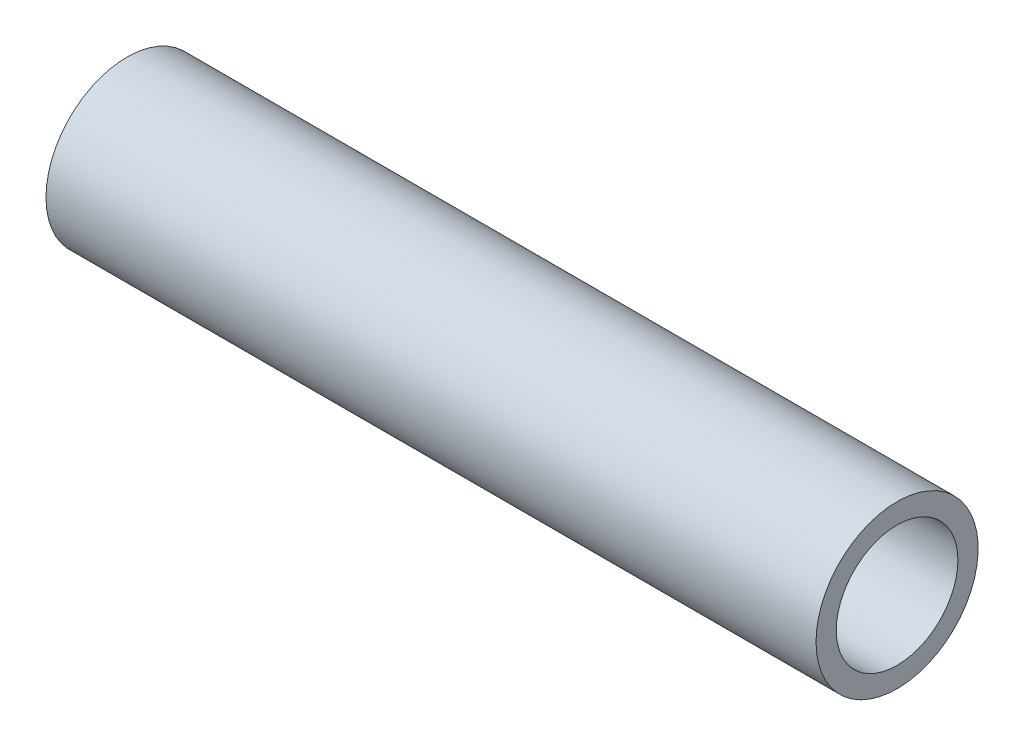
ISO-10303-21;
HEADER;
FILE_DESCRIPTION(('STEP AP214'),'2;1');
FILE_NAME('part.step','',(''),(''),'','','');
FILE_SCHEMA(('AUTOMOTIVE_DESIGN { 1 0 10303 214 1 1 1 1 }'));
ENDSEC;
DATA;
#1=APPLICATION_CONTEXT('core data for automotive mechanical design processes');
#2=APPLICATION_PROTOCOL_DEFINITION('international standard','automotive_design',2000,#1);
#3=PRODUCT_CONTEXT('',#1,'mechanical');
#4=PRODUCT('Part','Part','',(#3));
#5=PRODUCT_RELATED_PRODUCT_CATEGORY('part','',(#4));
#6=PRODUCT_DEFINITION_FORMATION('','',#4);
#7=PRODUCT_DEFINITION_CONTEXT('part definition',#1,'design');
#8=PRODUCT_DEFINITION('design','',#6,#7);
#9=PRODUCT_DEFINITION_SHAPE('','',#8);
#10=(LENGTH_UNIT() NAMED_UNIT(*) SI_UNIT(.MILLI.,.METRE.));
#11=(NAMED_UNIT(*) PLANE_ANGLE_UNIT() SI_UNIT($,.RADIAN.));
#12=(NAMED_UNIT(*) SI_UNIT($,.STERADIAN.) SOLID_ANGLE_UNIT());
#13=UNCERTAINTY_MEASURE_WITH_UNIT(LENGTH_MEASURE(1.E-05),#10,'distance_accuracy_value','');
#14=(GEOMETRIC_REPRESENTATION_CONTEXT(3) GLOBAL_UNCERTAINTY_ASSIGNED_CONTEXT((#13)) GLOBAL_UNIT_ASSIGNED_CONTEXT((#10,
#11,#12)) REPRESENTATION_CONTEXT('',''));
#15=CARTESIAN_POINT('',(0.,0.,0.));
#16=DIRECTION('',(0.,0.,1.));
#17=DIRECTION('',(1.,0.,0.));
#18=AXIS2_PLACEMENT_3D('',#15,#16,#17);
#19=CARTESIAN_POINT('',(0.,0.,0.));
#20=DIRECTION('',(1.,0.,0.));
#21=DIRECTION('',(0.,0.,-1.));
#22=AXIS2_PLACEMENT_3D('',#19,#20,#21);
#23=PLANE('',#22);
#24=CARTESIAN_POINT('',(0.,0.,0.));
#25=DIRECTION('',(-1.,0.,0.));
#26=DIRECTION('',(0.,0.,1.));
#27=AXIS2_PLACEMENT_3D('',#24,#25,#26);
#28=CIRCLE('',#27,4.);
#29=CARTESIAN_POINT('',(0.,0.,4.));
#30=VERTEX_POINT('',#29);
#31=EDGE_CURVE('E96',#30,#30,#28,.T.);
#32=ORIENTED_EDGE('',*,*,#31,.T.);
#33=EDGE_LOOP('',(#32));
#34=FACE_BOUND('',#33,.T.);
#35=CARTESIAN_POINT('',(0.,0.,0.));
#36=DIRECTION('',(1.,0.,0.));
#37=DIRECTION('',(0.,0.,-1.));
#38=AXIS2_PLACEMENT_3D('',#35,#36,#37);
#39=CIRCLE('',#38,3.);
#40=CARTESIAN_POINT('',(0.,0.,-3.));
#41=VERTEX_POINT('',#40);
#42=EDGE_CURVE('E51',#41,#41,#39,.F.);
#43=ORIENTED_EDGE('',*,*,#42,.F.);
#44=EDGE_LOOP('',(#43));
#45=FACE_BOUND('',#44,.T.);
#46=ADVANCED_FACE('F82',(#34,#45),#23,.F.);
#47=CARTESIAN_POINT('',(38.,0.,0.));
#48=DIRECTION('',(-1.,0.,0.));
#49=DIRECTION('',(0.,0.,1.));
#50=AXIS2_PLACEMENT_3D('',#47,#48,#49);
#51=PLANE('',#50);
#52=CARTESIAN_POINT('',(38.,0.,0.));
#53=DIRECTION('',(-1.,0.,0.));
#54=DIRECTION('',(0.,0.,1.));
#55=AXIS2_PLACEMENT_3D('',#52,#53,#54);
#56=CIRCLE('',#55,4.);
#57=CARTESIAN_POINT('',(38.,0.,4.));
#58=VERTEX_POINT('',#57);
#59=EDGE_CURVE('E103',#58,#58,#56,.T.);
#60=ORIENTED_EDGE('',*,*,#59,.F.);
#61=EDGE_LOOP('',(#60));
#62=FACE_BOUND('',#61,.T.);
#63=CARTESIAN_POINT('',(38.,0.,0.));
#64=DIRECTION('',(-1.,0.,0.));
#65=DIRECTION('',(0.,0.,1.));
#66=AXIS2_PLACEMENT_3D('',#63,#64,#65);
#67=CIRCLE('',#66,3.);
#68=CARTESIAN_POINT('',(38.,0.,3.));
#69=VERTEX_POINT('',#68);
#70=EDGE_CURVE('E89',#69,#69,#67,.F.);
#71=ORIENTED_EDGE('',*,*,#70,.F.);
#72=EDGE_LOOP('',(#71));
#73=FACE_BOUND('',#72,.T.);
#74=ADVANCED_FACE('F113',(#62,#73),#51,.F.);
#75=CARTESIAN_POINT('',(0.,0.,0.));
#76=DIRECTION('',(-1.,0.,0.));
#77=DIRECTION('',(0.,0.,1.));
#78=AXIS2_PLACEMENT_3D('',#75,#76,#77);
#79=CYLINDRICAL_SURFACE('',#78,4.);
#80=ORIENTED_EDGE('',*,*,#31,.F.);
#81=EDGE_LOOP('',(#80));
#82=FACE_BOUND('',#81,.T.);
#83=ORIENTED_EDGE('',*,*,#59,.T.);
#84=EDGE_LOOP('',(#83));
#85=FACE_BOUND('',#84,.T.);
#86=ADVANCED_FACE('F111',(#82,#85),#79,.T.);
#87=CARTESIAN_POINT('',(0.,0.,0.));
#88=DIRECTION('',(1.,0.,0.));
#89=DIRECTION('',(0.,0.,-1.));
#90=AXIS2_PLACEMENT_3D('',#87,#88,#89);
#91=CYLINDRICAL_SURFACE('',#90,3.);
#92=ORIENTED_EDGE('',*,*,#70,.T.);
#93=EDGE_LOOP('',(#92));
#94=FACE_BOUND('',#93,.T.);
#95=ORIENTED_EDGE('',*,*,#42,.T.);
#96=EDGE_LOOP('',(#95));
#97=FACE_BOUND('',#96,.T.);
#98=ADVANCED_FACE('F121',(#94,#97),#91,.F.);
#99=CLOSED_SHELL('',(#46,#74,#86,#98));
#100=MANIFOLD_SOLID_BREP('B6',#99);
#101=ADVANCED_BREP_SHAPE_REPRESENTATION('',(#18,#100),#14);
#102=SHAPE_DEFINITION_REPRESENTATION(#9,#101);
ENDSEC;
END-ISO-10303-21;
